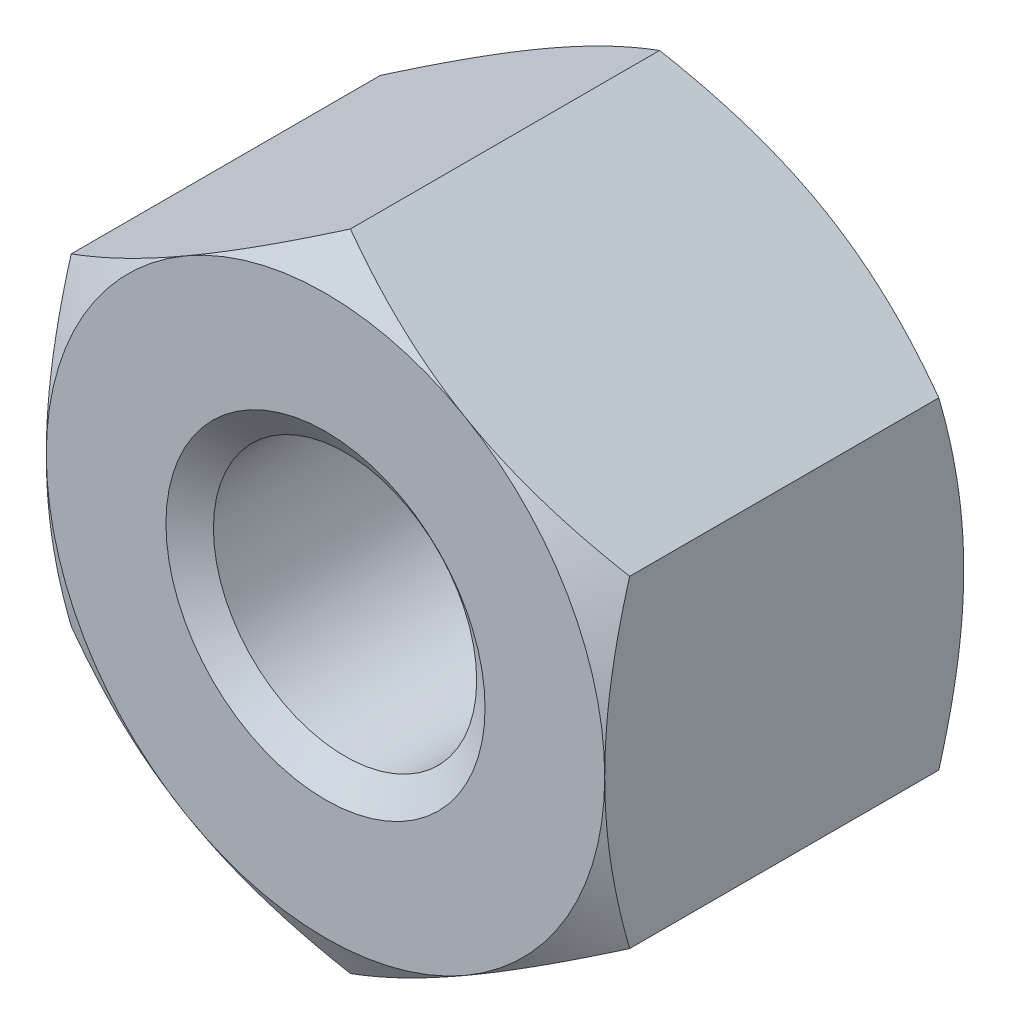
ISO-10303-21;
HEADER;
FILE_DESCRIPTION(('STEP AP214'),'2;1');
FILE_NAME('part.step','',(''),(''),'','','');
FILE_SCHEMA(('AUTOMOTIVE_DESIGN { 1 0 10303 214 1 1 1 1 }'));
ENDSEC;
DATA;
#1=APPLICATION_CONTEXT('core data for automotive mechanical design processes');
#2=APPLICATION_PROTOCOL_DEFINITION('international standard','automotive_design',2000,#1);
#3=PRODUCT_CONTEXT('',#1,'mechanical');
#4=PRODUCT('Part','Part','',(#3));
#5=PRODUCT_RELATED_PRODUCT_CATEGORY('part','',(#4));
#6=PRODUCT_DEFINITION_FORMATION('','',#4);
#7=PRODUCT_DEFINITION_CONTEXT('part definition',#1,'design');
#8=PRODUCT_DEFINITION('design','',#6,#7);
#9=PRODUCT_DEFINITION_SHAPE('','',#8);
#10=(LENGTH_UNIT() NAMED_UNIT(*) SI_UNIT(.MILLI.,.METRE.));
#11=(NAMED_UNIT(*) PLANE_ANGLE_UNIT() SI_UNIT($,.RADIAN.));
#12=(NAMED_UNIT(*) SI_UNIT($,.STERADIAN.) SOLID_ANGLE_UNIT());
#13=UNCERTAINTY_MEASURE_WITH_UNIT(LENGTH_MEASURE(1.E-05),#10,'distance_accuracy_value','');
#14=(GEOMETRIC_REPRESENTATION_CONTEXT(3) GLOBAL_UNCERTAINTY_ASSIGNED_CONTEXT((#13)) GLOBAL_UNIT_ASSIGNED_CONTEXT((#10,
#11,#12)) REPRESENTATION_CONTEXT('',''));
#15=CARTESIAN_POINT('',(0.,0.,0.));
#16=DIRECTION('',(0.,0.,1.));
#17=DIRECTION('',(1.,0.,0.));
#18=AXIS2_PLACEMENT_3D('',#15,#16,#17);
#19=CARTESIAN_POINT('',(0.,0.,-4.5));
#20=DIRECTION('',(0.,0.,1.));
#21=DIRECTION('',(1.,0.,0.));
#22=AXIS2_PLACEMENT_3D('',#19,#20,#21);
#23=CYLINDRICAL_SURFACE('',#22,1.65);
#24=CARTESIAN_POINT('',(0.,0.,-0.245072638373399));
#25=DIRECTION('',(0.,0.,1.));
#26=DIRECTION('',(1.,0.,0.));
#27=AXIS2_PLACEMENT_3D('',#24,#25,#26);
#28=CIRCLE('',#27,1.65);
#29=CARTESIAN_POINT('',(1.65,0.,-0.245072638373399));
#30=VERTEX_POINT('',#29);
#31=EDGE_CURVE('E177',#30,#30,#28,.F.);
#32=ORIENTED_EDGE('',*,*,#31,.F.);
#33=EDGE_LOOP('',(#32));
#34=FACE_BOUND('',#33,.T.);
#35=CARTESIAN_POINT('',(0.,0.,-4.2295273616266));
#36=DIRECTION('',(0.,0.,-1.));
#37=DIRECTION('',(-1.,0.,0.));
#38=AXIS2_PLACEMENT_3D('',#35,#36,#37);
#39=CIRCLE('',#38,1.65);
#40=CARTESIAN_POINT('',(-1.65,0.,-4.2295273616266));
#41=VERTEX_POINT('',#40);
#42=EDGE_CURVE('E41',#41,#41,#39,.F.);
#43=ORIENTED_EDGE('',*,*,#42,.F.);
#44=EDGE_LOOP('',(#43));
#45=FACE_BOUND('',#44,.T.);
#46=ADVANCED_FACE('F36',(#34,#45),#23,.F.);
#47=CARTESIAN_POINT('',(0.,4.04145188432738,-4.5));
#48=DIRECTION('',(-0.5,0.866025403784438,0.));
#49=DIRECTION('',(-0.866025403784438,-0.5,0.));
#50=AXIS2_PLACEMENT_3D('',#47,#48,#49);
#51=PLANE('',#50);
#52=DIRECTION('',(0.,0.,1.));
#53=VECTOR('',#52,1.);
#54=CARTESIAN_POINT('',(-3.5,2.02072594216369,-4.5));
#55=LINE('',#54,#53);
#56=CARTESIAN_POINT('',(-3.5,2.02072594216369,-4.18739260883036));
#57=VERTEX_POINT('',#56);
#58=CARTESIAN_POINT('',(-3.5,2.02072594216369,-0.312607391169644));
#59=VERTEX_POINT('',#58);
#60=EDGE_CURVE('E167',#57,#59,#55,.T.);
#61=ORIENTED_EDGE('',*,*,#60,.T.);
#62=CARTESIAN_POINT('',(-3.5002,2.02061047210985,-0.312674060693372));
#63=CARTESIAN_POINT('',(-3.34639282154755,2.10941108799267,-0.261385788989984));
#64=CARTESIAN_POINT('',(-3.19125798916558,2.19897822522909,-0.214740953816197));
#65=CARTESIAN_POINT('',(-2.87830199342322,2.37966345361545,-0.133321875533348));
#66=CARTESIAN_POINT('',(-2.7204752692125,2.47078475532382,-0.0985764355845612));
#67=CARTESIAN_POINT('',(-2.40677778961987,2.65189807961073,-0.0444900271828358));
#68=CARTESIAN_POINT('',(-2.25095530083931,2.74186223545399,-0.0247890862603812));
#69=CARTESIAN_POINT('',(-1.93857711279463,2.92221386641056,-0.0012701327372539));
#70=CARTESIAN_POINT('',(-1.78202254896577,3.01260068598001,0.00256735545443528));
#71=CARTESIAN_POINT('',(-1.48949078007901,3.1814939814933,-0.00541530187697733));
#72=CARTESIAN_POINT('',(-1.35346978754209,3.26002573814993,-0.0152754340696069));
#73=CARTESIAN_POINT('',(-1.082313979711,3.41657761679354,-0.0465264668994037));
#74=CARTESIAN_POINT('',(-0.947180102315317,3.49459719728458,-0.0679280432857986));
#75=CARTESIAN_POINT('',(-0.675465207594816,3.65147186489429,-0.121430407880578));
#76=CARTESIAN_POINT('',(-0.538918580721664,3.73030709667644,-0.153757994445087));
#77=CARTESIAN_POINT('',(-0.267861907055498,3.88680174018324,-0.227128933807995));
#78=CARTESIAN_POINT('',(-0.133348387531463,3.96446315689009,-0.268155046569868));
#79=CARTESIAN_POINT('',(0.000200000000000051,4.04156735438122,-0.312674060693372));
#80=B_SPLINE_CURVE_WITH_KNOTS('',3,(#62,#63,#64,#65,#66,#67,#68,#69,#70,#71,#72,#73,#74,#75,#76,
#77,#78,#79),.UNSPECIFIED.,.F.,.F.,(4,2,2,2,2,2,2,2,4),(0.,0.554793832886254,1.11092123814984,
1.65328467083219,2.19498204478403,2.6666513085086,3.13875761298267,3.6213361260051,
4.10296698719187),.UNSPECIFIED.);
#81=CARTESIAN_POINT('',(-1.75,3.03108891324554,0.));
#82=VERTEX_POINT('',#81);
#83=EDGE_CURVE('E63',#59,#82,#80,.T.);
#84=ORIENTED_EDGE('',*,*,#83,.T.);
#85=CARTESIAN_POINT('',(0.,4.04145188432738,-0.312607391169645));
#86=VERTEX_POINT('',#85);
#87=EDGE_CURVE('E246',#82,#86,#80,.T.);
#88=ORIENTED_EDGE('',*,*,#87,.T.);
#89=DIRECTION('',(0.,0.,1.));
#90=VECTOR('',#89,1.);
#91=CARTESIAN_POINT('',(0.,4.04145188432738,-4.5));
#92=LINE('',#91,#90);
#93=CARTESIAN_POINT('',(0.,4.04145188432738,-4.18739260883036));
#94=VERTEX_POINT('',#93);
#95=EDGE_CURVE('E152',#94,#86,#92,.T.);
#96=ORIENTED_EDGE('',*,*,#95,.F.);
#97=CARTESIAN_POINT('',(-3.5002,2.02061047210985,-4.18732593930663));
#98=CARTESIAN_POINT('',(-3.34639282154755,2.10941108799267,-4.23861421101002));
#99=CARTESIAN_POINT('',(-3.19125798916558,2.19897822522909,-4.2852590461838));
#100=CARTESIAN_POINT('',(-2.87830199342322,2.37966345361545,-4.36667812446665));
#101=CARTESIAN_POINT('',(-2.7204752692125,2.47078475532382,-4.40142356441544));
#102=CARTESIAN_POINT('',(-2.40677778961987,2.65189807961073,-4.45550997281716));
#103=CARTESIAN_POINT('',(-2.25095530083931,2.74186223545399,-4.47521091373962));
#104=CARTESIAN_POINT('',(-1.93857711279463,2.92221386641056,-4.49872986726275));
#105=CARTESIAN_POINT('',(-1.78202254896577,3.01260068598001,-4.50256735545443));
#106=CARTESIAN_POINT('',(-1.48949078007901,3.1814939814933,-4.49458469812302));
#107=CARTESIAN_POINT('',(-1.35346978754209,3.26002573814993,-4.48472456593039));
#108=CARTESIAN_POINT('',(-1.08231397971101,3.41657761679354,-4.4534735331006));
#109=CARTESIAN_POINT('',(-0.947180102315317,3.49459719728458,-4.4320719567142));
#110=CARTESIAN_POINT('',(-0.675465207594816,3.65147186489429,-4.37856959211942));
#111=CARTESIAN_POINT('',(-0.538918580721665,3.73030709667644,-4.34624200555491));
#112=CARTESIAN_POINT('',(-0.267861907055499,3.88680174018324,-4.27287106619201));
#113=CARTESIAN_POINT('',(-0.133348387531463,3.96446315689009,-4.23184495343013));
#114=CARTESIAN_POINT('',(0.00020000000000035,4.04156735438122,-4.18732593930663));
#115=B_SPLINE_CURVE_WITH_KNOTS('',3,(#97,#98,#99,#100,#101,#102,#103,#104,#105,#106,#107,#108,
#109,#110,#111,#112,#113,#114),.UNSPECIFIED.,.F.,.F.,(4,2,2,2,2,2,2,2,4),(0.,0.554793832886254,
1.11092123814984,1.65328467083219,2.19498204478403,2.6666513085086,3.13875761298267,
3.6213361260051,4.10296698719187),.UNSPECIFIED.);
#116=CARTESIAN_POINT('',(-1.75,3.03108891324554,-4.5));
#117=VERTEX_POINT('',#116);
#118=EDGE_CURVE('E170',#117,#94,#115,.T.);
#119=ORIENTED_EDGE('',*,*,#118,.F.);
#120=EDGE_CURVE('E269',#57,#117,#115,.T.);
#121=ORIENTED_EDGE('',*,*,#120,.F.);
#122=EDGE_LOOP('',(#61,#84,#88,#96,#119,#121));
#123=FACE_BOUND('',#122,.T.);
#124=ADVANCED_FACE('F38',(#123),#51,.T.);
#125=CARTESIAN_POINT('',(3.5,2.02072594216369,-4.5));
#126=DIRECTION('',(0.5,0.866025403784438,0.));
#127=DIRECTION('',(-0.866025403784438,0.500000000000001,0.));
#128=AXIS2_PLACEMENT_3D('',#125,#126,#127);
#129=PLANE('',#128);
#130=ORIENTED_EDGE('',*,*,#95,.T.);
#131=CARTESIAN_POINT('',(-0.000199999999999867,4.04156735438122,-0.312674060693373));
#132=CARTESIAN_POINT('',(0.15360717845245,3.9527667384984,-0.261385788989985));
#133=CARTESIAN_POINT('',(0.308742010834424,3.86319960126198,-0.214740953816198));
#134=CARTESIAN_POINT('',(0.621698006576782,3.68251437287562,-0.133321875533349));
#135=CARTESIAN_POINT('',(0.779524730787497,3.59139307116725,-0.0985764355845616));
#136=CARTESIAN_POINT('',(1.09322221038013,3.41027974688034,-0.0444900271828358));
#137=CARTESIAN_POINT('',(1.24904469916069,3.32031559103708,-0.024789086260381));
#138=CARTESIAN_POINT('',(1.56142288720538,3.13996396008051,-0.0012701327372538));
#139=CARTESIAN_POINT('',(1.71797745103423,3.04957714051106,0.00256735545443518));
#140=CARTESIAN_POINT('',(2.01050921992099,2.88068384499777,-0.00541530187697747));
#141=CARTESIAN_POINT('',(2.14653021245791,2.80215208834114,-0.0152754340696069));
#142=CARTESIAN_POINT('',(2.417686020289,2.64560020969753,-0.0465264668994033));
#143=CARTESIAN_POINT('',(2.55281989768468,2.5675806292065,-0.0679280432857979));
#144=CARTESIAN_POINT('',(2.82453479240518,2.41070596159678,-0.121430407880577));
#145=CARTESIAN_POINT('',(2.96108141927834,2.33187072981463,-0.153757994445087));
#146=CARTESIAN_POINT('',(3.2321380929445,2.17537608630783,-0.227128933807994));
#147=CARTESIAN_POINT('',(3.36665161246854,2.09771466960098,-0.268155046569867));
#148=CARTESIAN_POINT('',(3.5002,2.02061047210985,-0.312674060693371));
#149=B_SPLINE_CURVE_WITH_KNOTS('',3,(#131,#132,#133,#134,#135,#136,#137,#138,#139,#140,#141,
#142,#143,#144,#145,#146,#147,#148),.UNSPECIFIED.,.F.,.F.,(4,2,2,2,2,2,2,2,4),(0.,
0.554793832886254,1.11092123814984,1.65328467083219,2.19498204478403,2.6666513085086,
3.13875761298267,3.6213361260051,4.10296698719187),.UNSPECIFIED.);
#150=CARTESIAN_POINT('',(1.75,3.03108891324553,0.));
#151=VERTEX_POINT('',#150);
#152=EDGE_CURVE('E145',#86,#151,#149,.T.);
#153=ORIENTED_EDGE('',*,*,#152,.T.);
#154=CARTESIAN_POINT('',(3.5,2.02072594216369,-0.312607391169645));
#155=VERTEX_POINT('',#154);
#156=EDGE_CURVE('E131',#151,#155,#149,.T.);
#157=ORIENTED_EDGE('',*,*,#156,.T.);
#158=DIRECTION('',(0.,0.,1.));
#159=VECTOR('',#158,1.);
#160=CARTESIAN_POINT('',(3.5,2.02072594216369,-4.5));
#161=LINE('',#160,#159);
#162=CARTESIAN_POINT('',(3.5,2.02072594216369,-4.18739260883036));
#163=VERTEX_POINT('',#162);
#164=EDGE_CURVE('E144',#163,#155,#161,.T.);
#165=ORIENTED_EDGE('',*,*,#164,.F.);
#166=CARTESIAN_POINT('',(-0.000199999999999867,4.04156735438122,-4.18732593930663));
#167=CARTESIAN_POINT('',(0.15360717845245,3.9527667384984,-4.23861421101002));
#168=CARTESIAN_POINT('',(0.308742010834424,3.86319960126198,-4.2852590461838));
#169=CARTESIAN_POINT('',(0.621698006576781,3.68251437287562,-4.36667812446665));
#170=CARTESIAN_POINT('',(0.779524730787496,3.59139307116725,-4.40142356441544));
#171=CARTESIAN_POINT('',(1.09322221038013,3.41027974688034,-4.45550997281716));
#172=CARTESIAN_POINT('',(1.24904469916069,3.32031559103708,-4.47521091373962));
#173=CARTESIAN_POINT('',(1.56142288720537,3.13996396008051,-4.49872986726275));
#174=CARTESIAN_POINT('',(1.71797745103423,3.04957714051106,-4.50256735545443));
#175=CARTESIAN_POINT('',(2.01050921992099,2.88068384499777,-4.49458469812302));
#176=CARTESIAN_POINT('',(2.14653021245791,2.80215208834114,-4.48472456593039));
#177=CARTESIAN_POINT('',(2.417686020289,2.64560020969753,-4.4534735331006));
#178=CARTESIAN_POINT('',(2.55281989768468,2.5675806292065,-4.4320719567142));
#179=CARTESIAN_POINT('',(2.82453479240518,2.41070596159678,-4.37856959211942));
#180=CARTESIAN_POINT('',(2.96108141927834,2.33187072981463,-4.34624200555491));
#181=CARTESIAN_POINT('',(3.2321380929445,2.17537608630783,-4.27287106619201));
#182=CARTESIAN_POINT('',(3.36665161246854,2.09771466960098,-4.23184495343013));
#183=CARTESIAN_POINT('',(3.5002,2.02061047210985,-4.18732593930663));
#184=B_SPLINE_CURVE_WITH_KNOTS('',3,(#166,#167,#168,#169,#170,#171,#172,#173,#174,#175,#176,
#177,#178,#179,#180,#181,#182,#183),.UNSPECIFIED.,.F.,.F.,(4,2,2,2,2,2,2,2,4),(0.,
0.554793832886254,1.11092123814984,1.65328467083219,2.19498204478403,2.6666513085086,
3.13875761298267,3.6213361260051,4.10296698719187),.UNSPECIFIED.);
#185=CARTESIAN_POINT('',(1.75,3.03108891324553,-4.5));
#186=VERTEX_POINT('',#185);
#187=EDGE_CURVE('E262',#186,#163,#184,.T.);
#188=ORIENTED_EDGE('',*,*,#187,.F.);
#189=EDGE_CURVE('E268',#94,#186,#184,.T.);
#190=ORIENTED_EDGE('',*,*,#189,.F.);
#191=EDGE_LOOP('',(#130,#153,#157,#165,#188,#190));
#192=FACE_BOUND('',#191,.T.);
#193=ADVANCED_FACE('F142',(#192),#129,.T.);
#194=CARTESIAN_POINT('',(3.5,2.02072594216369,-4.5));
#195=DIRECTION('',(-1.,0.,0.));
#196=DIRECTION('',(0.,0.,1.));
#197=AXIS2_PLACEMENT_3D('',#194,#195,#196);
#198=PLANE('',#197);
#199=CARTESIAN_POINT('',(3.5,-5.35926299121405,-1.67484346858556));
#200=CARTESIAN_POINT('',(3.5,-5.20559319908842,-1.60058173692104));
#201=CARTESIAN_POINT('',(3.5,-5.05156008083375,-1.52705822833147));
#202=CARTESIAN_POINT('',(3.5,-4.7425707418071,-1.38190950344752));
#203=CARTESIAN_POINT('',(3.5,-4.58761436682436,-1.31028461582133));
#204=CARTESIAN_POINT('',(3.5,-4.27574500225542,-1.16897765517624));
#205=CARTESIAN_POINT('',(3.5,-4.11882589028192,-1.09930904568016));
#206=CARTESIAN_POINT('',(3.5,-3.80369792903855,-0.962964262242759));
#207=CARTESIAN_POINT('',(3.5,-3.64548914750595,-0.896287932319517));
#208=CARTESIAN_POINT('',(3.5,-3.32556618401855,-0.765931819095066));
#209=CARTESIAN_POINT('',(3.5,-3.16383281219923,-0.702298873688864));
#210=CARTESIAN_POINT('',(3.5,-2.83845840945597,-0.580016702089492));
#211=CARTESIAN_POINT('',(3.5,-2.67481716858826,-0.52136803037069));
#212=CARTESIAN_POINT('',(3.5,-2.34570278472049,-0.410630279877021));
#213=CARTESIAN_POINT('',(3.5,-2.18023438248742,-0.358527255435857));
#214=CARTESIAN_POINT('',(3.5,-1.84694522806369,-0.262572936976443));
#215=CARTESIAN_POINT('',(3.5,-1.6791252378753,-0.218719033467157));
#216=CARTESIAN_POINT('',(3.5,-1.34101828610925,-0.141391945584786));
#217=CARTESIAN_POINT('',(3.5,-1.17073068027693,-0.107921525211972));
#218=CARTESIAN_POINT('',(3.5,-0.828102385138483,-0.0536149564320502));
#219=CARTESIAN_POINT('',(3.5,-0.6557616940173,-0.0327788191952362));
#220=CARTESIAN_POINT('',(3.5,-0.311020490924448,-0.00558408650575642));
#221=CARTESIAN_POINT('',(3.5,-0.138627397207259,0.000866163165911387));
#222=CARTESIAN_POINT('',(3.5,0.206038074906536,-0.00105355807794622));
#223=CARTESIAN_POINT('',(3.5,0.37831047302318,-0.0094196819634321));
#224=CARTESIAN_POINT('',(3.5,0.672490555822328,-0.035768892786892));
#225=CARTESIAN_POINT('',(3.5,0.794722791084093,-0.0503206340384211));
#226=CARTESIAN_POINT('',(3.5,1.0382430543056,-0.0859367340533555));
#227=CARTESIAN_POINT('',(3.5,1.15953093025887,-0.107002119926141));
#228=CARTESIAN_POINT('',(3.5,1.52187914771348,-0.178863187081453));
#229=CARTESIAN_POINT('',(3.5,1.76124104212632,-0.23830527562201));
#230=CARTESIAN_POINT('',(3.5,2.11940971387708,-0.340826814402554));
#231=CARTESIAN_POINT('',(3.5,2.24008344316346,-0.377749699085183));
#232=CARTESIAN_POINT('',(3.5,2.48017139213728,-0.455249007699294));
#233=CARTESIAN_POINT('',(3.5,2.59958641795613,-0.49582291166355));
#234=CARTESIAN_POINT('',(3.5,2.83665760451798,-0.579779986782752));
#235=CARTESIAN_POINT('',(3.5,2.95431988203483,-0.623146060034314));
#236=CARTESIAN_POINT('',(3.5,3.188731535088,-0.712423559566866));
#237=CARTESIAN_POINT('',(3.5,3.30548051959464,-0.75833601459295));
#238=CARTESIAN_POINT('',(3.5,3.42180736613349,-0.80527038072407));
#239=B_SPLINE_CURVE_WITH_KNOTS('',3,(#199,#200,#201,#202,#203,#204,#205,#206,#207,#208,#209,
#210,#211,#212,#213,#214,#215,#216,#217,#218,#219,#220,#221,#222,#223,#224,#225,#226,#227,#228,
#229,#230,#231,#232,#233,#234,#235,#236,#237,#238),.UNSPECIFIED.,.F.,.F.,(4,2,2,2,2,2,2,2,2,2,2,
2,2,2,2,2,2,2,2,4),(0.,0.512025318465737,1.02413870177436,1.53918270315241,2.05419982499224,
2.57553975872798,3.09693761309353,3.617205066104,4.13730766217537,4.65754858684364,
5.17778997146961,5.69470725122282,6.211490334524,6.58059623222331,6.94976036239484,
7.68863804939851,8.06719621660478,8.4454950747676,8.82166461280099,9.1979872473341),.UNSPECIFIED.);
#240=CARTESIAN_POINT('',(3.5,-2.02072594216369,-0.312607391169645));
#241=VERTEX_POINT('',#240);
#242=CARTESIAN_POINT('',(3.5,0.,0.));
#243=VERTEX_POINT('',#242);
#244=EDGE_CURVE('E137',#241,#243,#239,.T.);
#245=ORIENTED_EDGE('',*,*,#244,.F.);
#246=DIRECTION('',(0.,0.,1.));
#247=VECTOR('',#246,1.);
#248=CARTESIAN_POINT('',(3.5,-2.02072594216369,-4.5));
#249=LINE('',#248,#247);
#250=CARTESIAN_POINT('',(3.5,-2.02072594216369,-4.18739260883036));
#251=VERTEX_POINT('',#250);
#252=EDGE_CURVE('E153',#251,#241,#249,.T.);
#253=ORIENTED_EDGE('',*,*,#252,.F.);
#254=CARTESIAN_POINT('',(3.5,-5.35926299121405,-2.82515653141444));
#255=CARTESIAN_POINT('',(3.5,-5.20559319908842,-2.89941826307897));
#256=CARTESIAN_POINT('',(3.5,-5.05156008083375,-2.97294177166853));
#257=CARTESIAN_POINT('',(3.5,-4.7425707418071,-3.11809049655248));
#258=CARTESIAN_POINT('',(3.5,-4.58761436682436,-3.18971538417867));
#259=CARTESIAN_POINT('',(3.5,-4.27574500225542,-3.33102234482376));
#260=CARTESIAN_POINT('',(3.5,-4.11882589028192,-3.40069095431984));
#261=CARTESIAN_POINT('',(3.5,-3.80369792903855,-3.53703573775724));
#262=CARTESIAN_POINT('',(3.5,-3.64548914750595,-3.60371206768048));
#263=CARTESIAN_POINT('',(3.5,-3.32556618401855,-3.73406818090494));
#264=CARTESIAN_POINT('',(3.5,-3.16383281219923,-3.79770112631114));
#265=CARTESIAN_POINT('',(3.5,-2.83845840945597,-3.91998329791051));
#266=CARTESIAN_POINT('',(3.5,-2.67481716858826,-3.97863196962931));
#267=CARTESIAN_POINT('',(3.5,-2.34570278472049,-4.08936972012298));
#268=CARTESIAN_POINT('',(3.5,-2.18023438248742,-4.14147274456414));
#269=CARTESIAN_POINT('',(3.5,-1.8469452280637,-4.23742706302356));
#270=CARTESIAN_POINT('',(3.5,-1.6791252378753,-4.28128096653284));
#271=CARTESIAN_POINT('',(3.5,-1.34101828610925,-4.35860805441521));
#272=CARTESIAN_POINT('',(3.5,-1.17073068027693,-4.39207847478803));
#273=CARTESIAN_POINT('',(3.5,-0.828102385138484,-4.44638504356795));
#274=CARTESIAN_POINT('',(3.5,-0.655761694017301,-4.46722118080476));
#275=CARTESIAN_POINT('',(3.5,-0.311020490924449,-4.49441591349424));
#276=CARTESIAN_POINT('',(3.5,-0.138627397207259,-4.50086616316591));
#277=CARTESIAN_POINT('',(3.5,0.206038074906536,-4.49894644192205));
#278=CARTESIAN_POINT('',(3.5,0.37831047302318,-4.49058031803657));
#279=CARTESIAN_POINT('',(3.5,0.672490555822328,-4.46423110721311));
#280=CARTESIAN_POINT('',(3.5,0.794722791084093,-4.44967936596158));
#281=CARTESIAN_POINT('',(3.5,1.0382430543056,-4.41406326594664));
#282=CARTESIAN_POINT('',(3.5,1.15953093025887,-4.39299788007386));
#283=CARTESIAN_POINT('',(3.5,1.52187914771348,-4.32113681291855));
#284=CARTESIAN_POINT('',(3.5,1.76124104212632,-4.26169472437799));
#285=CARTESIAN_POINT('',(3.5,2.11940971387709,-4.15917318559744));
#286=CARTESIAN_POINT('',(3.5,2.24008344316347,-4.12225030091482));
#287=CARTESIAN_POINT('',(3.5,2.48017139213729,-4.04475099230071));
#288=CARTESIAN_POINT('',(3.5,2.59958641795613,-4.00417708833645));
#289=CARTESIAN_POINT('',(3.5,2.83665760451799,-3.92022001321725));
#290=CARTESIAN_POINT('',(3.5,2.95431988203484,-3.87685393996568));
#291=CARTESIAN_POINT('',(3.5,3.18873153508801,-3.78757644043313));
#292=CARTESIAN_POINT('',(3.5,3.30548051959465,-3.74166398540705));
#293=CARTESIAN_POINT('',(3.5,3.4218073661335,-3.69472961927593));
#294=B_SPLINE_CURVE_WITH_KNOTS('',3,(#254,#255,#256,#257,#258,#259,#260,#261,#262,#263,#264,
#265,#266,#267,#268,#269,#270,#271,#272,#273,#274,#275,#276,#277,#278,#279,#280,#281,#282,#283,
#284,#285,#286,#287,#288,#289,#290,#291,#292,#293),.UNSPECIFIED.,.F.,.F.,(4,2,2,2,2,2,2,2,2,2,2,
2,2,2,2,2,2,2,2,4),(0.,0.512025318465736,1.02413870177436,1.53918270315241,2.05419982499223,
2.57553975872798,3.09693761309353,3.617205066104,4.13730766217537,4.65754858684364,
5.17778997146961,5.69470725122282,6.211490334524,6.58059623222331,6.94976036239485,
7.68863804939851,8.06719621660478,8.44549507476761,8.821664612801,9.19798724733411),.UNSPECIFIED.);
#295=CARTESIAN_POINT('',(3.5,0.,-4.5));
#296=VERTEX_POINT('',#295);
#297=EDGE_CURVE('E275',#251,#296,#294,.T.);
#298=ORIENTED_EDGE('',*,*,#297,.T.);
#299=EDGE_CURVE('E151',#296,#163,#294,.T.);
#300=ORIENTED_EDGE('',*,*,#299,.T.);
#301=ORIENTED_EDGE('',*,*,#164,.T.);
#302=EDGE_CURVE('E128',#243,#155,#239,.T.);
#303=ORIENTED_EDGE('',*,*,#302,.F.);
#304=EDGE_LOOP('',(#245,#253,#298,#300,#301,#303));
#305=FACE_BOUND('',#304,.T.);
#306=ADVANCED_FACE('F148',(#305),#198,.F.);
#307=CARTESIAN_POINT('',(0.,-4.04145188432739,-4.5));
#308=DIRECTION('',(0.5,-0.866025403784438,0.));
#309=DIRECTION('',(0.866025403784438,0.500000000000001,0.));
#310=AXIS2_PLACEMENT_3D('',#307,#308,#309);
#311=PLANE('',#310);
#312=ORIENTED_EDGE('',*,*,#252,.T.);
#313=CARTESIAN_POINT('',(3.5002,-2.02061047210985,-0.312674060693373));
#314=CARTESIAN_POINT('',(3.34639282154755,-2.10941108799267,-0.261385788989985));
#315=CARTESIAN_POINT('',(3.19125798916558,-2.19897822522909,-0.214740953816198));
#316=CARTESIAN_POINT('',(2.87830199342322,-2.37966345361545,-0.13332187553335));
#317=CARTESIAN_POINT('',(2.7204752692125,-2.47078475532382,-0.0985764355845621));
#318=CARTESIAN_POINT('',(2.40677778961987,-2.65189807961074,-0.0444900271828367));
#319=CARTESIAN_POINT('',(2.25095530083931,-2.741862235454,-0.0247890862603822));
#320=CARTESIAN_POINT('',(1.93857711279463,-2.92221386641056,-0.00127013273725534));
#321=CARTESIAN_POINT('',(1.78202254896577,-3.01260068598001,0.00256735545443363));
#322=CARTESIAN_POINT('',(1.48949078007901,-3.1814939814933,-0.00541530187697917));
#323=CARTESIAN_POINT('',(1.35346978754209,-3.26002573814993,-0.0152754340696088));
#324=CARTESIAN_POINT('',(1.082313979711,-3.41657761679354,-0.0465264668994055));
#325=CARTESIAN_POINT('',(0.947180102315316,-3.49459719728458,-0.0679280432858003));
#326=CARTESIAN_POINT('',(0.675465207594816,-3.65147186489429,-0.12143040788058));
#327=CARTESIAN_POINT('',(0.538918580721664,-3.73030709667644,-0.15375799444509));
#328=CARTESIAN_POINT('',(0.267861907055498,-3.88680174018325,-0.227128933807997));
#329=CARTESIAN_POINT('',(0.133348387531463,-3.96446315689009,-0.26815504656987));
#330=CARTESIAN_POINT('',(-0.00020000000000024,-4.04156735438122,-0.312674060693374));
#331=B_SPLINE_CURVE_WITH_KNOTS('',3,(#313,#314,#315,#316,#317,#318,#319,#320,#321,#322,#323,
#324,#325,#326,#327,#328,#329,#330),.UNSPECIFIED.,.F.,.F.,(4,2,2,2,2,2,2,2,4),(0.,
0.554793832886255,1.11092123814984,1.65328467083219,2.19498204478403,2.6666513085086,
3.13875761298267,3.6213361260051,4.10296698719187),.UNSPECIFIED.);
#332=CARTESIAN_POINT('',(1.75,-3.03108891324553,0.));
#333=VERTEX_POINT('',#332);
#334=EDGE_CURVE('E550',#241,#333,#331,.T.);
#335=ORIENTED_EDGE('',*,*,#334,.T.);
#336=CARTESIAN_POINT('',(0.,-4.04145188432738,-0.312607391169645));
#337=VERTEX_POINT('',#336);
#338=EDGE_CURVE('E230',#333,#337,#331,.T.);
#339=ORIENTED_EDGE('',*,*,#338,.T.);
#340=DIRECTION('',(0.,0.,1.));
#341=VECTOR('',#340,1.);
#342=CARTESIAN_POINT('',(0.,-4.04145188432739,-4.5));
#343=LINE('',#342,#341);
#344=CARTESIAN_POINT('',(0.,-4.04145188432738,-4.18739260883036));
#345=VERTEX_POINT('',#344);
#346=EDGE_CURVE('E158',#345,#337,#343,.T.);
#347=ORIENTED_EDGE('',*,*,#346,.F.);
#348=CARTESIAN_POINT('',(3.5002,-2.02061047210985,-4.18732593930663));
#349=CARTESIAN_POINT('',(3.34639282154755,-2.10941108799267,-4.23861421101002));
#350=CARTESIAN_POINT('',(3.19125798916558,-2.19897822522909,-4.2852590461838));
#351=CARTESIAN_POINT('',(2.87830199342322,-2.37966345361545,-4.36667812446665));
#352=CARTESIAN_POINT('',(2.7204752692125,-2.47078475532382,-4.40142356441544));
#353=CARTESIAN_POINT('',(2.40677778961987,-2.65189807961074,-4.45550997281716));
#354=CARTESIAN_POINT('',(2.25095530083931,-2.74186223545399,-4.47521091373962));
#355=CARTESIAN_POINT('',(1.93857711279463,-2.92221386641056,-4.49872986726275));
#356=CARTESIAN_POINT('',(1.78202254896577,-3.01260068598001,-4.50256735545443));
#357=CARTESIAN_POINT('',(1.48949078007901,-3.1814939814933,-4.49458469812302));
#358=CARTESIAN_POINT('',(1.35346978754209,-3.26002573814993,-4.48472456593039));
#359=CARTESIAN_POINT('',(1.082313979711,-3.41657761679354,-4.45347353310059));
#360=CARTESIAN_POINT('',(0.947180102315317,-3.49459719728458,-4.4320719567142));
#361=CARTESIAN_POINT('',(0.675465207594816,-3.65147186489429,-4.37856959211942));
#362=CARTESIAN_POINT('',(0.538918580721664,-3.73030709667644,-4.34624200555491));
#363=CARTESIAN_POINT('',(0.267861907055498,-3.88680174018325,-4.272871066192));
#364=CARTESIAN_POINT('',(0.133348387531463,-3.96446315689009,-4.23184495343013));
#365=CARTESIAN_POINT('',(-0.000200000000000382,-4.04156735438122,-4.18732593930663));
#366=B_SPLINE_CURVE_WITH_KNOTS('',3,(#348,#349,#350,#351,#352,#353,#354,#355,#356,#357,#358,
#359,#360,#361,#362,#363,#364,#365),.UNSPECIFIED.,.F.,.F.,(4,2,2,2,2,2,2,2,4),(0.,
0.554793832886254,1.11092123814984,1.65328467083219,2.19498204478403,2.6666513085086,
3.13875761298267,3.6213361260051,4.10296698719187),.UNSPECIFIED.);
#367=CARTESIAN_POINT('',(1.75,-3.03108891324553,-4.5));
#368=VERTEX_POINT('',#367);
#369=EDGE_CURVE('E282',#368,#345,#366,.T.);
#370=ORIENTED_EDGE('',*,*,#369,.F.);
#371=EDGE_CURVE('E281',#251,#368,#366,.T.);
#372=ORIENTED_EDGE('',*,*,#371,.F.);
#373=EDGE_LOOP('',(#312,#335,#339,#347,#370,#372));
#374=FACE_BOUND('',#373,.T.);
#375=ADVANCED_FACE('F294',(#374),#311,.T.);
#376=CARTESIAN_POINT('',(-3.5,-2.02072594216369,-4.5));
#377=DIRECTION('',(-0.500000000000001,-0.866025403784438,0.));
#378=DIRECTION('',(0.866025403784438,-0.500000000000001,0.));
#379=AXIS2_PLACEMENT_3D('',#376,#377,#378);
#380=PLANE('',#379);
#381=ORIENTED_EDGE('',*,*,#346,.T.);
#382=CARTESIAN_POINT('',(0.000199999999999875,-4.04156735438122,-0.312674060693375));
#383=CARTESIAN_POINT('',(-0.15360717845245,-3.9527667384984,-0.261385788989987));
#384=CARTESIAN_POINT('',(-0.308742010834424,-3.86319960126198,-0.2147409538162));
#385=CARTESIAN_POINT('',(-0.621698006576782,-3.68251437287563,-0.133321875533351));
#386=CARTESIAN_POINT('',(-0.779524730787497,-3.59139307116725,-0.0985764355845636));
#387=CARTESIAN_POINT('',(-1.09322221038013,-3.41027974688034,-0.0444900271828379));
#388=CARTESIAN_POINT('',(-1.24904469916069,-3.32031559103708,-0.0247890862603832));
#389=CARTESIAN_POINT('',(-1.56142288720538,-3.13996396008052,-0.00127013273725568));
#390=CARTESIAN_POINT('',(-1.71797745103423,-3.04957714051106,0.00256735545443355));
#391=CARTESIAN_POINT('',(-2.01050921992099,-2.88068384499777,-0.00541530187697885));
#392=CARTESIAN_POINT('',(-2.14653021245791,-2.80215208834115,-0.0152754340696083));
#393=CARTESIAN_POINT('',(-2.417686020289,-2.64560020969754,-0.0465264668994047));
#394=CARTESIAN_POINT('',(-2.55281989768468,-2.5675806292065,-0.0679280432857993));
#395=CARTESIAN_POINT('',(-2.82453479240518,-2.41070596159679,-0.121430407880578));
#396=CARTESIAN_POINT('',(-2.96108141927834,-2.33187072981464,-0.153757994445088));
#397=CARTESIAN_POINT('',(-3.2321380929445,-2.17537608630783,-0.227128933807995));
#398=CARTESIAN_POINT('',(-3.36665161246854,-2.09771466960099,-0.268155046569868));
#399=CARTESIAN_POINT('',(-3.5002,-2.02061047210985,-0.312674060693372));
#400=B_SPLINE_CURVE_WITH_KNOTS('',3,(#382,#383,#384,#385,#386,#387,#388,#389,#390,#391,#392,
#393,#394,#395,#396,#397,#398,#399),.UNSPECIFIED.,.F.,.F.,(4,2,2,2,2,2,2,2,4),(0.,
0.554793832886255,1.11092123814984,1.65328467083219,2.19498204478403,2.6666513085086,
3.13875761298267,3.6213361260051,4.10296698719187),.UNSPECIFIED.);
#401=CARTESIAN_POINT('',(-1.75,-3.03108891324553,0.));
#402=VERTEX_POINT('',#401);
#403=EDGE_CURVE('E548',#337,#402,#400,.T.);
#404=ORIENTED_EDGE('',*,*,#403,.T.);
#405=CARTESIAN_POINT('',(-3.5,-2.02072594216369,-0.312607391169645));
#406=VERTEX_POINT('',#405);
#407=EDGE_CURVE('E202',#402,#406,#400,.T.);
#408=ORIENTED_EDGE('',*,*,#407,.T.);
#409=DIRECTION('',(0.,0.,1.));
#410=VECTOR('',#409,1.);
#411=CARTESIAN_POINT('',(-3.5,-2.02072594216369,-4.5));
#412=LINE('',#411,#410);
#413=CARTESIAN_POINT('',(-3.5,-2.02072594216369,-4.18739260883036));
#414=VERTEX_POINT('',#413);
#415=EDGE_CURVE('E164',#414,#406,#412,.T.);
#416=ORIENTED_EDGE('',*,*,#415,.F.);
#417=CARTESIAN_POINT('',(0.000199999999999875,-4.04156735438122,-4.18732593930663));
#418=CARTESIAN_POINT('',(-0.15360717845245,-3.9527667384984,-4.23861421101001));
#419=CARTESIAN_POINT('',(-0.308742010834424,-3.86319960126198,-4.2852590461838));
#420=CARTESIAN_POINT('',(-0.621698006576782,-3.68251437287563,-4.36667812446665));
#421=CARTESIAN_POINT('',(-0.779524730787497,-3.59139307116725,-4.40142356441544));
#422=CARTESIAN_POINT('',(-1.09322221038013,-3.41027974688034,-4.45550997281716));
#423=CARTESIAN_POINT('',(-1.24904469916069,-3.32031559103708,-4.47521091373962));
#424=CARTESIAN_POINT('',(-1.56142288720538,-3.13996396008052,-4.49872986726274));
#425=CARTESIAN_POINT('',(-1.71797745103423,-3.04957714051106,-4.50256735545443));
#426=CARTESIAN_POINT('',(-2.01050921992099,-2.88068384499777,-4.49458469812302));
#427=CARTESIAN_POINT('',(-2.14653021245791,-2.80215208834115,-4.48472456593039));
#428=CARTESIAN_POINT('',(-2.417686020289,-2.64560020969754,-4.4534735331006));
#429=CARTESIAN_POINT('',(-2.55281989768468,-2.5675806292065,-4.4320719567142));
#430=CARTESIAN_POINT('',(-2.82453479240519,-2.41070596159679,-4.37856959211942));
#431=CARTESIAN_POINT('',(-2.96108141927834,-2.33187072981464,-4.34624200555491));
#432=CARTESIAN_POINT('',(-3.2321380929445,-2.17537608630783,-4.272871066192));
#433=CARTESIAN_POINT('',(-3.36665161246854,-2.09771466960098,-4.23184495343013));
#434=CARTESIAN_POINT('',(-3.5002,-2.02061047210985,-4.18732593930663));
#435=B_SPLINE_CURVE_WITH_KNOTS('',3,(#417,#418,#419,#420,#421,#422,#423,#424,#425,#426,#427,
#428,#429,#430,#431,#432,#433,#434),.UNSPECIFIED.,.F.,.F.,(4,2,2,2,2,2,2,2,4),(0.,
0.554793832886254,1.11092123814984,1.65328467083219,2.19498204478403,2.6666513085086,
3.13875761298267,3.6213361260051,4.10296698719187),.UNSPECIFIED.);
#436=CARTESIAN_POINT('',(-1.75,-3.03108891324553,-4.5));
#437=VERTEX_POINT('',#436);
#438=EDGE_CURVE('E289',#437,#414,#435,.T.);
#439=ORIENTED_EDGE('',*,*,#438,.F.);
#440=EDGE_CURVE('E288',#345,#437,#435,.T.);
#441=ORIENTED_EDGE('',*,*,#440,.F.);
#442=EDGE_LOOP('',(#381,#404,#408,#416,#439,#441));
#443=FACE_BOUND('',#442,.T.);
#444=ADVANCED_FACE('F297',(#443),#380,.T.);
#445=CARTESIAN_POINT('',(-3.5,2.02072594216369,-4.5));
#446=DIRECTION('',(-1.,0.,0.));
#447=DIRECTION('',(0.,0.,1.));
#448=AXIS2_PLACEMENT_3D('',#445,#446,#447);
#449=PLANE('',#448);
#450=ORIENTED_EDGE('',*,*,#415,.T.);
#451=CARTESIAN_POINT('',(-3.5,-5.35926299121405,-1.67484346858556));
#452=CARTESIAN_POINT('',(-3.5,-5.20559319908842,-1.60058173692104));
#453=CARTESIAN_POINT('',(-3.5,-5.05156008083375,-1.52705822833147));
#454=CARTESIAN_POINT('',(-3.5,-4.7425707418071,-1.38190950344752));
#455=CARTESIAN_POINT('',(-3.5,-4.58761436682436,-1.31028461582133));
#456=CARTESIAN_POINT('',(-3.5,-4.27574500225542,-1.16897765517624));
#457=CARTESIAN_POINT('',(-3.5,-4.11882589028192,-1.09930904568016));
#458=CARTESIAN_POINT('',(-3.5,-3.80369792903855,-0.96296426224276));
#459=CARTESIAN_POINT('',(-3.5,-3.64548914750595,-0.896287932319518));
#460=CARTESIAN_POINT('',(-3.5,-3.32556618401855,-0.765931819095067));
#461=CARTESIAN_POINT('',(-3.5,-3.16383281219924,-0.702298873688865));
#462=CARTESIAN_POINT('',(-3.5,-2.83845840945597,-0.580016702089492));
#463=CARTESIAN_POINT('',(-3.5,-2.67481716858826,-0.521368030370691));
#464=CARTESIAN_POINT('',(-3.5,-2.34570278472049,-0.410630279877021));
#465=CARTESIAN_POINT('',(-3.5,-2.18023438248742,-0.358527255435857));
#466=CARTESIAN_POINT('',(-3.5,-1.84694522806369,-0.262572936976443));
#467=CARTESIAN_POINT('',(-3.5,-1.6791252378753,-0.218719033467157));
#468=CARTESIAN_POINT('',(-3.5,-1.34101828610925,-0.141391945584786));
#469=CARTESIAN_POINT('',(-3.5,-1.17073068027693,-0.107921525211972));
#470=CARTESIAN_POINT('',(-3.5,-0.828102385138482,-0.05361495643205));
#471=CARTESIAN_POINT('',(-3.5,-0.6557616940173,-0.0327788191952361));
#472=CARTESIAN_POINT('',(-3.5,-0.311020490924448,-0.00558408650575648));
#473=CARTESIAN_POINT('',(-3.5,-0.138627397207258,0.000866163165911363));
#474=CARTESIAN_POINT('',(-3.5,0.206038074906536,-0.0010535580779462));
#475=CARTESIAN_POINT('',(-3.5,0.37831047302318,-0.00941968196343206));
#476=CARTESIAN_POINT('',(-3.5,0.672490555822328,-0.035768892786892));
#477=CARTESIAN_POINT('',(-3.5,0.794722791084093,-0.0503206340384212));
#478=CARTESIAN_POINT('',(-3.5,1.0382430543056,-0.0859367340533555));
#479=CARTESIAN_POINT('',(-3.5,1.15953093025887,-0.107002119926141));
#480=CARTESIAN_POINT('',(-3.5,1.52187914771348,-0.178863187081453));
#481=CARTESIAN_POINT('',(-3.5,1.76124104212632,-0.238305275622009));
#482=CARTESIAN_POINT('',(-3.5,2.11940971387708,-0.340826814402554));
#483=CARTESIAN_POINT('',(-3.5,2.24008344316346,-0.377749699085183));
#484=CARTESIAN_POINT('',(-3.5,2.48017139213728,-0.455249007699294));
#485=CARTESIAN_POINT('',(-3.5,2.59958641795613,-0.495822911663549));
#486=CARTESIAN_POINT('',(-3.5,2.83665760451798,-0.579779986782752));
#487=CARTESIAN_POINT('',(-3.5,2.95431988203483,-0.623146060034314));
#488=CARTESIAN_POINT('',(-3.5,3.188731535088,-0.712423559566866));
#489=CARTESIAN_POINT('',(-3.5,3.30548051959464,-0.75833601459295));
#490=CARTESIAN_POINT('',(-3.5,3.42180736613349,-0.805270380724071));
#491=B_SPLINE_CURVE_WITH_KNOTS('',3,(#451,#452,#453,#454,#455,#456,#457,#458,#459,#460,#461,
#462,#463,#464,#465,#466,#467,#468,#469,#470,#471,#472,#473,#474,#475,#476,#477,#478,#479,#480,
#481,#482,#483,#484,#485,#486,#487,#488,#489,#490),.UNSPECIFIED.,.F.,.F.,(4,2,2,2,2,2,2,2,2,2,2,
2,2,2,2,2,2,2,2,4),(0.,0.512025318465737,1.02413870177436,1.53918270315241,2.05419982499223,
2.57553975872798,3.09693761309353,3.617205066104,4.13730766217537,4.65754858684365,
5.17778997146961,5.69470725122282,6.21149033452401,6.58059623222331,6.94976036239485,
7.68863804939851,8.06719621660478,8.4454950747676,8.82166461280099,9.19798724733411),.UNSPECIFIED.);
#492=CARTESIAN_POINT('',(-3.5,0.,0.));
#493=VERTEX_POINT('',#492);
#494=EDGE_CURVE('E201',#406,#493,#491,.T.);
#495=ORIENTED_EDGE('',*,*,#494,.T.);
#496=EDGE_CURVE('E194',#493,#59,#491,.T.);
#497=ORIENTED_EDGE('',*,*,#496,.T.);
#498=ORIENTED_EDGE('',*,*,#60,.F.);
#499=CARTESIAN_POINT('',(-3.5,-5.35926299121405,-2.82515653141444));
#500=CARTESIAN_POINT('',(-3.5,-5.20559319908842,-2.89941826307897));
#501=CARTESIAN_POINT('',(-3.5,-5.05156008083375,-2.97294177166853));
#502=CARTESIAN_POINT('',(-3.5,-4.7425707418071,-3.11809049655248));
#503=CARTESIAN_POINT('',(-3.5,-4.58761436682436,-3.18971538417867));
#504=CARTESIAN_POINT('',(-3.5,-4.27574500225542,-3.33102234482376));
#505=CARTESIAN_POINT('',(-3.5,-4.11882589028192,-3.40069095431984));
#506=CARTESIAN_POINT('',(-3.5,-3.80369792903855,-3.53703573775724));
#507=CARTESIAN_POINT('',(-3.5,-3.64548914750595,-3.60371206768048));
#508=CARTESIAN_POINT('',(-3.5,-3.32556618401855,-3.73406818090493));
#509=CARTESIAN_POINT('',(-3.5,-3.16383281219923,-3.79770112631114));
#510=CARTESIAN_POINT('',(-3.5,-2.83845840945597,-3.91998329791051));
#511=CARTESIAN_POINT('',(-3.5,-2.67481716858826,-3.97863196962931));
#512=CARTESIAN_POINT('',(-3.5,-2.34570278472049,-4.08936972012298));
#513=CARTESIAN_POINT('',(-3.5,-2.18023438248742,-4.14147274456414));
#514=CARTESIAN_POINT('',(-3.5,-1.8469452280637,-4.23742706302356));
#515=CARTESIAN_POINT('',(-3.5,-1.6791252378753,-4.28128096653284));
#516=CARTESIAN_POINT('',(-3.5,-1.34101828610925,-4.35860805441521));
#517=CARTESIAN_POINT('',(-3.5,-1.17073068027693,-4.39207847478803));
#518=CARTESIAN_POINT('',(-3.5,-0.828102385138483,-4.44638504356795));
#519=CARTESIAN_POINT('',(-3.5,-0.6557616940173,-4.46722118080476));
#520=CARTESIAN_POINT('',(-3.5,-0.311020490924448,-4.49441591349424));
#521=CARTESIAN_POINT('',(-3.5,-0.138627397207258,-4.50086616316591));
#522=CARTESIAN_POINT('',(-3.5,0.206038074906537,-4.49894644192205));
#523=CARTESIAN_POINT('',(-3.5,0.378310473023181,-4.49058031803657));
#524=CARTESIAN_POINT('',(-3.5,0.672490555822329,-4.46423110721311));
#525=CARTESIAN_POINT('',(-3.5,0.794722791084094,-4.44967936596158));
#526=CARTESIAN_POINT('',(-3.5,1.0382430543056,-4.41406326594664));
#527=CARTESIAN_POINT('',(-3.5,1.15953093025887,-4.39299788007386));
#528=CARTESIAN_POINT('',(-3.5,1.52187914771348,-4.32113681291855));
#529=CARTESIAN_POINT('',(-3.5,1.76124104212632,-4.26169472437799));
#530=CARTESIAN_POINT('',(-3.5,2.11940971387709,-4.15917318559744));
#531=CARTESIAN_POINT('',(-3.5,2.24008344316347,-4.12225030091482));
#532=CARTESIAN_POINT('',(-3.5,2.48017139213729,-4.04475099230071));
#533=CARTESIAN_POINT('',(-3.5,2.59958641795613,-4.00417708833645));
#534=CARTESIAN_POINT('',(-3.5,2.83665760451799,-3.92022001321725));
#535=CARTESIAN_POINT('',(-3.5,2.95431988203484,-3.87685393996568));
#536=CARTESIAN_POINT('',(-3.5,3.18873153508801,-3.78757644043313));
#537=CARTESIAN_POINT('',(-3.5,3.30548051959465,-3.74166398540705));
#538=CARTESIAN_POINT('',(-3.5,3.4218073661335,-3.69472961927593));
#539=B_SPLINE_CURVE_WITH_KNOTS('',3,(#499,#500,#501,#502,#503,#504,#505,#506,#507,#508,#509,
#510,#511,#512,#513,#514,#515,#516,#517,#518,#519,#520,#521,#522,#523,#524,#525,#526,#527,#528,
#529,#530,#531,#532,#533,#534,#535,#536,#537,#538),.UNSPECIFIED.,.F.,.F.,(4,2,2,2,2,2,2,2,2,2,2,
2,2,2,2,2,2,2,2,4),(0.,0.512025318465737,1.02413870177436,1.53918270315241,2.05419982499223,
2.57553975872798,3.09693761309353,3.617205066104,4.13730766217537,4.65754858684364,
5.17778997146961,5.69470725122282,6.211490334524,6.58059623222331,6.94976036239485,
7.68863804939851,8.06719621660478,8.44549507476761,8.821664612801,9.19798724733411),.UNSPECIFIED.);
#540=CARTESIAN_POINT('',(-3.5,0.,-4.5));
#541=VERTEX_POINT('',#540);
#542=EDGE_CURVE('E336',#541,#57,#539,.T.);
#543=ORIENTED_EDGE('',*,*,#542,.F.);
#544=EDGE_CURVE('E351',#414,#541,#539,.T.);
#545=ORIENTED_EDGE('',*,*,#544,.F.);
#546=EDGE_LOOP('',(#450,#495,#497,#498,#543,#545));
#547=FACE_BOUND('',#546,.T.);
#548=ADVANCED_FACE('F209',(#547),#449,.T.);
#549=CARTESIAN_POINT('',(-7.,0.,0.));
#550=DIRECTION('',(0.,0.,1.));
#551=DIRECTION('',(1.,0.,0.));
#552=AXIS2_PLACEMENT_3D('',#549,#550,#551);
#553=PLANE('',#552);
#554=CARTESIAN_POINT('',(0.,0.,0.));
#555=DIRECTION('',(0.,0.,1.));
#556=DIRECTION('',(1.,0.,0.));
#557=AXIS2_PLACEMENT_3D('',#554,#555,#556);
#558=CIRCLE('',#557,2.);
#559=CARTESIAN_POINT('',(2.,0.,0.));
#560=VERTEX_POINT('',#559);
#561=EDGE_CURVE('E179',#560,#560,#558,.T.);
#562=ORIENTED_EDGE('',*,*,#561,.F.);
#563=EDGE_LOOP('',(#562));
#564=FACE_BOUND('',#563,.T.);
#565=CARTESIAN_POINT('',(0.,0.,0.));
#566=DIRECTION('',(0.,0.,1.));
#567=DIRECTION('',(1.,0.,0.));
#568=AXIS2_PLACEMENT_3D('',#565,#566,#567);
#569=CIRCLE('',#568,3.5);
#570=EDGE_CURVE('E48',#333,#243,#569,.T.);
#571=ORIENTED_EDGE('',*,*,#570,.T.);
#572=CARTESIAN_POINT('',(0.,0.,0.));
#573=DIRECTION('',(0.,0.,1.));
#574=DIRECTION('',(1.,0.,0.));
#575=AXIS2_PLACEMENT_3D('',#572,#573,#574);
#576=CIRCLE('',#575,3.5);
#577=EDGE_CURVE('E55',#243,#151,#576,.T.);
#578=ORIENTED_EDGE('',*,*,#577,.T.);
#579=EDGE_CURVE('E11',#151,#82,#569,.T.);
#580=ORIENTED_EDGE('',*,*,#579,.T.);
#581=EDGE_CURVE('E46',#82,#493,#569,.T.);
#582=ORIENTED_EDGE('',*,*,#581,.T.);
#583=EDGE_CURVE('E372',#493,#402,#569,.T.);
#584=ORIENTED_EDGE('',*,*,#583,.T.);
#585=EDGE_CURVE('E176',#402,#333,#569,.T.);
#586=ORIENTED_EDGE('',*,*,#585,.T.);
#587=EDGE_LOOP('',(#571,#578,#580,#582,#584,#586));
#588=FACE_BOUND('',#587,.T.);
#589=ADVANCED_FACE('F258',(#564,#588),#553,.T.);
#590=CARTESIAN_POINT('',(-7.,0.,-4.5));
#591=DIRECTION('',(0.,0.,1.));
#592=DIRECTION('',(1.,0.,0.));
#593=AXIS2_PLACEMENT_3D('',#590,#591,#592);
#594=PLANE('',#593);
#595=CARTESIAN_POINT('',(0.,0.,-4.5));
#596=DIRECTION('',(0.,0.,1.));
#597=DIRECTION('',(1.,0.,0.));
#598=AXIS2_PLACEMENT_3D('',#595,#596,#597);
#599=CIRCLE('',#598,2.);
#600=CARTESIAN_POINT('',(2.,0.,-4.5));
#601=VERTEX_POINT('',#600);
#602=EDGE_CURVE('E180',#601,#601,#599,.F.);
#603=ORIENTED_EDGE('',*,*,#602,.F.);
#604=EDGE_LOOP('',(#603));
#605=FACE_BOUND('',#604,.T.);
#606=CARTESIAN_POINT('',(0.,0.,-4.5));
#607=DIRECTION('',(0.,0.,1.));
#608=DIRECTION('',(1.,0.,0.));
#609=AXIS2_PLACEMENT_3D('',#606,#607,#608);
#610=CIRCLE('',#609,3.5);
#611=EDGE_CURVE('E253',#296,#186,#610,.T.);
#612=ORIENTED_EDGE('',*,*,#611,.F.);
#613=CARTESIAN_POINT('',(0.,0.,-4.5));
#614=DIRECTION('',(0.,0.,1.));
#615=DIRECTION('',(1.,0.,0.));
#616=AXIS2_PLACEMENT_3D('',#613,#614,#615);
#617=CIRCLE('',#616,3.5);
#618=EDGE_CURVE('E171',#296,#368,#617,.F.);
#619=ORIENTED_EDGE('',*,*,#618,.T.);
#620=EDGE_CURVE('E173',#368,#437,#617,.F.);
#621=ORIENTED_EDGE('',*,*,#620,.T.);
#622=EDGE_CURVE('E381',#437,#541,#617,.F.);
#623=ORIENTED_EDGE('',*,*,#622,.T.);
#624=EDGE_CURVE('E364',#541,#117,#617,.F.);
#625=ORIENTED_EDGE('',*,*,#624,.T.);
#626=EDGE_CURVE('E155',#117,#186,#617,.F.);
#627=ORIENTED_EDGE('',*,*,#626,.T.);
#628=EDGE_LOOP('',(#612,#619,#621,#623,#625,#627));
#629=FACE_BOUND('',#628,.T.);
#630=ADVANCED_FACE('F316',(#605,#629),#594,.F.);
#631=CARTESIAN_POINT('',(0.,0.,-4.5));
#632=DIRECTION('',(0.,0.,1.));
#633=DIRECTION('',(1.,0.,0.));
#634=AXIS2_PLACEMENT_3D('',#631,#632,#633);
#635=CONICAL_SURFACE('',#634,3.5,1.0471975511966);
#636=ORIENTED_EDGE('',*,*,#187,.T.);
#637=ORIENTED_EDGE('',*,*,#299,.F.);
#638=ORIENTED_EDGE('',*,*,#611,.T.);
#639=EDGE_LOOP('',(#636,#637,#638));
#640=FACE_BOUND('',#639,.T.);
#641=ADVANCED_FACE('F318',(#640),#635,.T.);
#642=ORIENTED_EDGE('',*,*,#118,.T.);
#643=ORIENTED_EDGE('',*,*,#189,.T.);
#644=ORIENTED_EDGE('',*,*,#626,.F.);
#645=EDGE_LOOP('',(#642,#643,#644));
#646=FACE_BOUND('',#645,.T.);
#647=ADVANCED_FACE('F324',(#646),#635,.T.);
#648=ORIENTED_EDGE('',*,*,#120,.T.);
#649=ORIENTED_EDGE('',*,*,#624,.F.);
#650=ORIENTED_EDGE('',*,*,#542,.T.);
#651=EDGE_LOOP('',(#648,#649,#650));
#652=FACE_BOUND('',#651,.T.);
#653=ADVANCED_FACE('F363',(#652),#635,.T.);
#654=ORIENTED_EDGE('',*,*,#438,.T.);
#655=ORIENTED_EDGE('',*,*,#544,.T.);
#656=ORIENTED_EDGE('',*,*,#622,.F.);
#657=EDGE_LOOP('',(#654,#655,#656));
#658=FACE_BOUND('',#657,.T.);
#659=ADVANCED_FACE('F222',(#658),#635,.T.);
#660=ORIENTED_EDGE('',*,*,#369,.T.);
#661=ORIENTED_EDGE('',*,*,#440,.T.);
#662=ORIENTED_EDGE('',*,*,#620,.F.);
#663=EDGE_LOOP('',(#660,#661,#662));
#664=FACE_BOUND('',#663,.T.);
#665=ADVANCED_FACE('F346',(#664),#635,.T.);
#666=ORIENTED_EDGE('',*,*,#371,.T.);
#667=ORIENTED_EDGE('',*,*,#618,.F.);
#668=ORIENTED_EDGE('',*,*,#297,.F.);
#669=EDGE_LOOP('',(#666,#667,#668));
#670=FACE_BOUND('',#669,.T.);
#671=ADVANCED_FACE('F326',(#670),#635,.T.);
#672=CARTESIAN_POINT('',(0.,0.,0.));
#673=DIRECTION('',(0.,0.,-1.));
#674=DIRECTION('',(-1.,0.,0.));
#675=AXIS2_PLACEMENT_3D('',#672,#673,#674);
#676=CONICAL_SURFACE('',#675,3.5,1.0471975511966);
#677=ORIENTED_EDGE('',*,*,#244,.T.);
#678=ORIENTED_EDGE('',*,*,#570,.F.);
#679=ORIENTED_EDGE('',*,*,#334,.F.);
#680=EDGE_LOOP('',(#677,#678,#679));
#681=FACE_BOUND('',#680,.T.);
#682=ADVANCED_FACE('F415',(#681),#676,.T.);
#683=ORIENTED_EDGE('',*,*,#585,.F.);
#684=ORIENTED_EDGE('',*,*,#403,.F.);
#685=ORIENTED_EDGE('',*,*,#338,.F.);
#686=EDGE_LOOP('',(#683,#684,#685));
#687=FACE_BOUND('',#686,.T.);
#688=ADVANCED_FACE('F217',(#687),#676,.T.);
#689=ORIENTED_EDGE('',*,*,#583,.F.);
#690=ORIENTED_EDGE('',*,*,#494,.F.);
#691=ORIENTED_EDGE('',*,*,#407,.F.);
#692=EDGE_LOOP('',(#689,#690,#691));
#693=FACE_BOUND('',#692,.T.);
#694=ADVANCED_FACE('F211',(#693),#676,.T.);
#695=ORIENTED_EDGE('',*,*,#496,.F.);
#696=ORIENTED_EDGE('',*,*,#581,.F.);
#697=ORIENTED_EDGE('',*,*,#83,.F.);
#698=EDGE_LOOP('',(#695,#696,#697));
#699=FACE_BOUND('',#698,.T.);
#700=ADVANCED_FACE('F216',(#699),#676,.T.);
#701=ORIENTED_EDGE('',*,*,#579,.F.);
#702=ORIENTED_EDGE('',*,*,#152,.F.);
#703=ORIENTED_EDGE('',*,*,#87,.F.);
#704=EDGE_LOOP('',(#701,#702,#703));
#705=FACE_BOUND('',#704,.T.);
#706=ADVANCED_FACE('F219',(#705),#676,.T.);
#707=ORIENTED_EDGE('',*,*,#577,.F.);
#708=ORIENTED_EDGE('',*,*,#302,.T.);
#709=ORIENTED_EDGE('',*,*,#156,.F.);
#710=EDGE_LOOP('',(#707,#708,#709));
#711=FACE_BOUND('',#710,.T.);
#712=ADVANCED_FACE('F130',(#711),#676,.T.);
#713=CARTESIAN_POINT('',(0.,0.,-0.269579902210739));
#714=DIRECTION('',(0.,0.,1.));
#715=DIRECTION('',(1.,0.,0.));
#716=AXIS2_PLACEMENT_3D('',#713,#714,#715);
#717=CONICAL_SURFACE('',#716,1.615,0.95993108859688);
#718=ORIENTED_EDGE('',*,*,#561,.T.);
#719=EDGE_LOOP('',(#718));
#720=FACE_BOUND('',#719,.T.);
#721=ORIENTED_EDGE('',*,*,#31,.T.);
#722=EDGE_LOOP('',(#721));
#723=FACE_BOUND('',#722,.T.);
#724=ADVANCED_FACE('F220',(#720,#723),#717,.F.);
#725=CARTESIAN_POINT('',(0.,0.,-4.4746));
#726=DIRECTION('',(0.,0.,-1.));
#727=DIRECTION('',(-1.,0.,0.));
#728=AXIS2_PLACEMENT_3D('',#725,#726,#727);
#729=CONICAL_SURFACE('',#728,2.,0.959931088596887);
#730=CARTESIAN_POINT('',(0.,0.,-4.4746));
#731=DIRECTION('',(0.,0.,1.));
#732=DIRECTION('',(1.,0.,0.));
#733=AXIS2_PLACEMENT_3D('',#730,#731,#732);
#734=CIRCLE('',#733,2.);
#735=CARTESIAN_POINT('',(2.,0.,-4.4746));
#736=VERTEX_POINT('',#735);
#737=EDGE_CURVE('E182',#736,#736,#734,.T.);
#738=ORIENTED_EDGE('',*,*,#737,.F.);
#739=EDGE_LOOP('',(#738));
#740=FACE_BOUND('',#739,.T.);
#741=ORIENTED_EDGE('',*,*,#42,.T.);
#742=EDGE_LOOP('',(#741));
#743=FACE_BOUND('',#742,.T.);
#744=ADVANCED_FACE('F483',(#740,#743),#729,.F.);
#745=CARTESIAN_POINT('',(0.,0.,-25.0375057290932));
#746=DIRECTION('',(0.,0.,1.));
#747=DIRECTION('',(1.,0.,0.));
#748=AXIS2_PLACEMENT_3D('',#745,#746,#747);
#749=CYLINDRICAL_SURFACE('',#748,2.);
#750=ORIENTED_EDGE('',*,*,#737,.T.);
#751=EDGE_LOOP('',(#750));
#752=FACE_BOUND('',#751,.T.);
#753=ORIENTED_EDGE('',*,*,#602,.T.);
#754=EDGE_LOOP('',(#753));
#755=FACE_BOUND('',#754,.T.);
#756=ADVANCED_FACE('F492',(#752,#755),#749,.F.);
#757=CLOSED_SHELL('',(#46,#124,#193,#306,#375,#444,#548,#589,#630,#641,#647,#653,#659,#665,#671,
#682,#688,#694,#700,#706,#712,#724,#744,#756));
#758=MANIFOLD_SOLID_BREP('B2',#757);
#759=ADVANCED_BREP_SHAPE_REPRESENTATION('',(#18,#758),#14);
#760=SHAPE_DEFINITION_REPRESENTATION(#9,#759);
ENDSEC;
END-ISO-10303-21;
